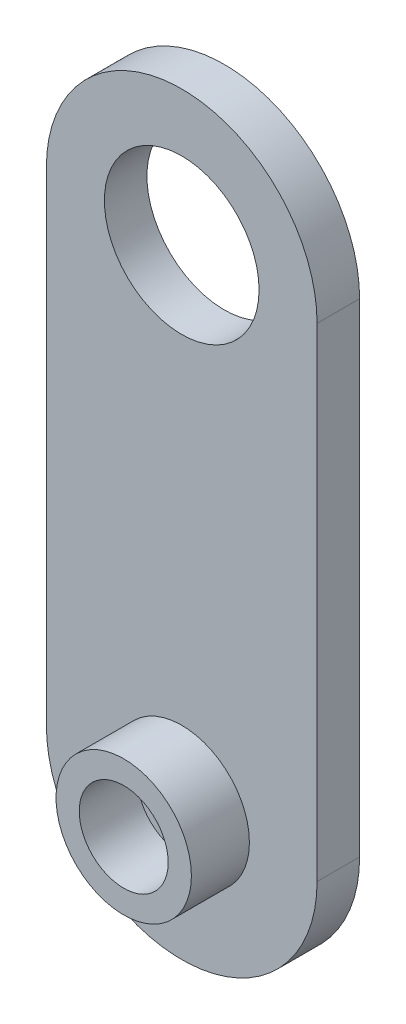
ISO-10303-21;
HEADER;
FILE_DESCRIPTION(('STEP AP214'),'2;1');
FILE_NAME('part.step','',(''),(''),'','','');
FILE_SCHEMA(('AUTOMOTIVE_DESIGN { 1 0 10303 214 1 1 1 1 }'));
ENDSEC;
DATA;
#1=APPLICATION_CONTEXT('core data for automotive mechanical design processes');
#2=APPLICATION_PROTOCOL_DEFINITION('international standard','automotive_design',2000,#1);
#3=PRODUCT_CONTEXT('',#1,'mechanical');
#4=PRODUCT('Part','Part','',(#3));
#5=PRODUCT_RELATED_PRODUCT_CATEGORY('part','',(#4));
#6=PRODUCT_DEFINITION_FORMATION('','',#4);
#7=PRODUCT_DEFINITION_CONTEXT('part definition',#1,'design');
#8=PRODUCT_DEFINITION('design','',#6,#7);
#9=PRODUCT_DEFINITION_SHAPE('','',#8);
#10=(LENGTH_UNIT() NAMED_UNIT(*) SI_UNIT(.MILLI.,.METRE.));
#11=(NAMED_UNIT(*) PLANE_ANGLE_UNIT() SI_UNIT($,.RADIAN.));
#12=(NAMED_UNIT(*) SI_UNIT($,.STERADIAN.) SOLID_ANGLE_UNIT());
#13=UNCERTAINTY_MEASURE_WITH_UNIT(LENGTH_MEASURE(1.E-05),#10,'distance_accuracy_value','');
#14=(GEOMETRIC_REPRESENTATION_CONTEXT(3) GLOBAL_UNCERTAINTY_ASSIGNED_CONTEXT((#13)) GLOBAL_UNIT_ASSIGNED_CONTEXT((#10,
#11,#12)) REPRESENTATION_CONTEXT('',''));
#15=CARTESIAN_POINT('',(0.,0.,0.));
#16=DIRECTION('',(0.,0.,1.));
#17=DIRECTION('',(1.,0.,0.));
#18=AXIS2_PLACEMENT_3D('',#15,#16,#17);
#19=CARTESIAN_POINT('',(0.,0.,2.2));
#20=DIRECTION('',(0.,0.,-1.));
#21=DIRECTION('',(-1.,0.,0.));
#22=AXIS2_PLACEMENT_3D('',#19,#20,#21);
#23=CYLINDRICAL_SURFACE('',#22,1.1);
#24=CARTESIAN_POINT('',(0.,0.,2.2));
#25=DIRECTION('',(0.,0.,1.));
#26=DIRECTION('',(1.,0.,0.));
#27=AXIS2_PLACEMENT_3D('',#24,#25,#26);
#28=CIRCLE('',#27,1.1);
#29=CARTESIAN_POINT('',(1.1,0.,2.2));
#30=VERTEX_POINT('',#29);
#31=EDGE_CURVE('E139',#30,#30,#28,.T.);
#32=ORIENTED_EDGE('',*,*,#31,.T.);
#33=EDGE_LOOP('',(#32));
#34=FACE_BOUND('',#33,.T.);
#35=CARTESIAN_POINT('',(0.,0.,1.));
#36=DIRECTION('',(0.,0.,-1.));
#37=DIRECTION('',(-1.,0.,0.));
#38=AXIS2_PLACEMENT_3D('',#35,#36,#37);
#39=CIRCLE('',#38,1.1);
#40=CARTESIAN_POINT('',(-1.1,0.,1.));
#41=VERTEX_POINT('',#40);
#42=EDGE_CURVE('E45',#41,#41,#39,.T.);
#43=ORIENTED_EDGE('',*,*,#42,.T.);
#44=EDGE_LOOP('',(#43));
#45=FACE_BOUND('',#44,.T.);
#46=ADVANCED_FACE('F41',(#34,#45),#23,.F.);
#47=CARTESIAN_POINT('',(0.,0.,2.2));
#48=DIRECTION('',(0.,0.,1.));
#49=DIRECTION('',(1.,0.,0.));
#50=AXIS2_PLACEMENT_3D('',#47,#48,#49);
#51=PLANE('',#50);
#52=ORIENTED_EDGE('',*,*,#31,.F.);
#53=EDGE_LOOP('',(#52));
#54=FACE_BOUND('',#53,.T.);
#55=CARTESIAN_POINT('',(0.,0.,2.2));
#56=DIRECTION('',(0.,0.,1.));
#57=DIRECTION('',(1.,0.,0.));
#58=AXIS2_PLACEMENT_3D('',#55,#56,#57);
#59=CIRCLE('',#58,2.3);
#60=CARTESIAN_POINT('',(2.3,0.,2.2));
#61=VERTEX_POINT('',#60);
#62=EDGE_CURVE('E11',#61,#61,#59,.F.);
#63=ORIENTED_EDGE('',*,*,#62,.F.);
#64=EDGE_LOOP('',(#63));
#65=FACE_BOUND('',#64,.T.);
#66=ADVANCED_FACE('F182',(#54,#65),#51,.T.);
#67=CARTESIAN_POINT('',(7.,0.,2.2));
#68=DIRECTION('',(1.,0.,0.));
#69=DIRECTION('',(0.,0.,-1.));
#70=AXIS2_PLACEMENT_3D('',#67,#68,#69);
#71=PLANE('',#70);
#72=DIRECTION('',(0.,-1.,0.));
#73=VECTOR('',#72,1.);
#74=CARTESIAN_POINT('',(7.,0.,0.));
#75=LINE('',#74,#73);
#76=CARTESIAN_POINT('',(7.,25.,0.));
#77=VERTEX_POINT('',#76);
#78=CARTESIAN_POINT('',(7.,0.,0.));
#79=VERTEX_POINT('',#78);
#80=EDGE_CURVE('E127',#77,#79,#75,.T.);
#81=ORIENTED_EDGE('',*,*,#80,.F.);
#82=DIRECTION('',(0.,0.,-1.));
#83=VECTOR('',#82,1.);
#84=CARTESIAN_POINT('',(7.,25.,2.2));
#85=LINE('',#84,#83);
#86=CARTESIAN_POINT('',(7.,25.,2.2));
#87=VERTEX_POINT('',#86);
#88=EDGE_CURVE('E52',#87,#77,#85,.T.);
#89=ORIENTED_EDGE('',*,*,#88,.F.);
#90=DIRECTION('',(0.,-1.,0.));
#91=VECTOR('',#90,1.);
#92=CARTESIAN_POINT('',(7.,0.,2.2));
#93=LINE('',#92,#91);
#94=CARTESIAN_POINT('',(7.,0.,2.2));
#95=VERTEX_POINT('',#94);
#96=EDGE_CURVE('E103',#87,#95,#93,.T.);
#97=ORIENTED_EDGE('',*,*,#96,.T.);
#98=DIRECTION('',(0.,0.,-1.));
#99=VECTOR('',#98,1.);
#100=CARTESIAN_POINT('',(7.,0.,2.2));
#101=LINE('',#100,#99);
#102=EDGE_CURVE('E83',#95,#79,#101,.T.);
#103=ORIENTED_EDGE('',*,*,#102,.T.);
#104=EDGE_LOOP('',(#81,#89,#97,#103));
#105=FACE_BOUND('',#104,.T.);
#106=ADVANCED_FACE('F187',(#105),#71,.T.);
#107=CARTESIAN_POINT('',(0.,25.,2.2));
#108=DIRECTION('',(0.,0.,-1.));
#109=DIRECTION('',(-1.,0.,0.));
#110=AXIS2_PLACEMENT_3D('',#107,#108,#109);
#111=CYLINDRICAL_SURFACE('',#110,7.);
#112=CARTESIAN_POINT('',(0.,25.,0.));
#113=DIRECTION('',(0.,0.,1.));
#114=DIRECTION('',(1.,0.,0.));
#115=AXIS2_PLACEMENT_3D('',#112,#113,#114);
#116=CIRCLE('',#115,7.);
#117=CARTESIAN_POINT('',(-7.,25.,0.));
#118=VERTEX_POINT('',#117);
#119=EDGE_CURVE('E109',#77,#118,#116,.T.);
#120=ORIENTED_EDGE('',*,*,#119,.T.);
#121=DIRECTION('',(0.,0.,-1.));
#122=VECTOR('',#121,1.);
#123=CARTESIAN_POINT('',(-7.,25.,2.2));
#124=LINE('',#123,#122);
#125=CARTESIAN_POINT('',(-7.,25.,2.2));
#126=VERTEX_POINT('',#125);
#127=EDGE_CURVE('E96',#126,#118,#124,.T.);
#128=ORIENTED_EDGE('',*,*,#127,.F.);
#129=CARTESIAN_POINT('',(0.,25.,2.2));
#130=DIRECTION('',(0.,0.,1.));
#131=DIRECTION('',(1.,0.,0.));
#132=AXIS2_PLACEMENT_3D('',#129,#130,#131);
#133=CIRCLE('',#132,7.);
#134=EDGE_CURVE('E100',#87,#126,#133,.T.);
#135=ORIENTED_EDGE('',*,*,#134,.F.);
#136=ORIENTED_EDGE('',*,*,#88,.T.);
#137=EDGE_LOOP('',(#120,#128,#135,#136));
#138=FACE_BOUND('',#137,.T.);
#139=ADVANCED_FACE('F107',(#138),#111,.T.);
#140=CARTESIAN_POINT('',(-7.,0.,2.2));
#141=DIRECTION('',(1.,0.,0.));
#142=DIRECTION('',(0.,0.,-1.));
#143=AXIS2_PLACEMENT_3D('',#140,#141,#142);
#144=PLANE('',#143);
#145=DIRECTION('',(0.,-1.,0.));
#146=VECTOR('',#145,1.);
#147=CARTESIAN_POINT('',(-7.,0.,0.));
#148=LINE('',#147,#146);
#149=CARTESIAN_POINT('',(-7.,0.,0.));
#150=VERTEX_POINT('',#149);
#151=EDGE_CURVE('E122',#118,#150,#148,.T.);
#152=ORIENTED_EDGE('',*,*,#151,.T.);
#153=DIRECTION('',(0.,0.,-1.));
#154=VECTOR('',#153,1.);
#155=CARTESIAN_POINT('',(-7.,0.,2.2));
#156=LINE('',#155,#154);
#157=CARTESIAN_POINT('',(-7.,0.,2.2));
#158=VERTEX_POINT('',#157);
#159=EDGE_CURVE('E98',#158,#150,#156,.T.);
#160=ORIENTED_EDGE('',*,*,#159,.F.);
#161=DIRECTION('',(0.,-1.,0.));
#162=VECTOR('',#161,1.);
#163=CARTESIAN_POINT('',(-7.,0.,2.2));
#164=LINE('',#163,#162);
#165=EDGE_CURVE('E91',#126,#158,#164,.T.);
#166=ORIENTED_EDGE('',*,*,#165,.F.);
#167=ORIENTED_EDGE('',*,*,#127,.T.);
#168=EDGE_LOOP('',(#152,#160,#166,#167));
#169=FACE_BOUND('',#168,.T.);
#170=ADVANCED_FACE('F94',(#169),#144,.F.);
#171=CARTESIAN_POINT('',(0.,25.,2.2));
#172=DIRECTION('',(0.,0.,-1.));
#173=DIRECTION('',(-1.,0.,0.));
#174=AXIS2_PLACEMENT_3D('',#171,#172,#173);
#175=CYLINDRICAL_SURFACE('',#174,4.);
#176=CARTESIAN_POINT('',(0.,25.,2.2));
#177=DIRECTION('',(0.,0.,1.));
#178=DIRECTION('',(1.,0.,0.));
#179=AXIS2_PLACEMENT_3D('',#176,#177,#178);
#180=CIRCLE('',#179,4.);
#181=CARTESIAN_POINT('',(4.,25.,2.2));
#182=VERTEX_POINT('',#181);
#183=EDGE_CURVE('E121',#182,#182,#180,.F.);
#184=ORIENTED_EDGE('',*,*,#183,.F.);
#185=EDGE_LOOP('',(#184));
#186=FACE_BOUND('',#185,.T.);
#187=CARTESIAN_POINT('',(0.,25.,0.));
#188=DIRECTION('',(0.,0.,1.));
#189=DIRECTION('',(1.,0.,0.));
#190=AXIS2_PLACEMENT_3D('',#187,#188,#189);
#191=CIRCLE('',#190,4.);
#192=CARTESIAN_POINT('',(4.,25.,0.));
#193=VERTEX_POINT('',#192);
#194=EDGE_CURVE('E130',#193,#193,#191,.F.);
#195=ORIENTED_EDGE('',*,*,#194,.T.);
#196=EDGE_LOOP('',(#195));
#197=FACE_BOUND('',#196,.T.);
#198=ADVANCED_FACE('F43',(#186,#197),#175,.F.);
#199=CARTESIAN_POINT('',(0.,0.,2.2));
#200=DIRECTION('',(0.,0.,-1.));
#201=DIRECTION('',(-1.,0.,0.));
#202=AXIS2_PLACEMENT_3D('',#199,#200,#201);
#203=CYLINDRICAL_SURFACE('',#202,7.);
#204=CARTESIAN_POINT('',(0.,0.,0.));
#205=DIRECTION('',(0.,0.,1.));
#206=DIRECTION('',(1.,0.,0.));
#207=AXIS2_PLACEMENT_3D('',#204,#205,#206);
#208=CIRCLE('',#207,7.);
#209=EDGE_CURVE('E76',#150,#79,#208,.T.);
#210=ORIENTED_EDGE('',*,*,#209,.T.);
#211=ORIENTED_EDGE('',*,*,#102,.F.);
#212=CARTESIAN_POINT('',(0.,0.,2.2));
#213=DIRECTION('',(0.,0.,1.));
#214=DIRECTION('',(1.,0.,0.));
#215=AXIS2_PLACEMENT_3D('',#212,#213,#214);
#216=CIRCLE('',#215,7.);
#217=EDGE_CURVE('E60',#158,#95,#216,.T.);
#218=ORIENTED_EDGE('',*,*,#217,.F.);
#219=ORIENTED_EDGE('',*,*,#159,.T.);
#220=EDGE_LOOP('',(#210,#211,#218,#219));
#221=FACE_BOUND('',#220,.T.);
#222=ADVANCED_FACE('F197',(#221),#203,.T.);
#223=CARTESIAN_POINT('',(0.,0.,2.2));
#224=DIRECTION('',(0.,0.,1.));
#225=DIRECTION('',(1.,0.,0.));
#226=AXIS2_PLACEMENT_3D('',#223,#224,#225);
#227=CIRCLE('',#226,3.5);
#228=CARTESIAN_POINT('',(3.5,0.,2.2));
#229=VERTEX_POINT('',#228);
#230=EDGE_CURVE('E146',#229,#229,#227,.T.);
#231=ORIENTED_EDGE('',*,*,#230,.F.);
#232=EDGE_LOOP('',(#231));
#233=FACE_BOUND('',#232,.T.);
#234=ORIENTED_EDGE('',*,*,#183,.T.);
#235=EDGE_LOOP('',(#234));
#236=FACE_BOUND('',#235,.T.);
#237=ORIENTED_EDGE('',*,*,#96,.F.);
#238=ORIENTED_EDGE('',*,*,#134,.T.);
#239=ORIENTED_EDGE('',*,*,#165,.T.);
#240=ORIENTED_EDGE('',*,*,#217,.T.);
#241=EDGE_LOOP('',(#237,#238,#239,#240));
#242=FACE_BOUND('',#241,.T.);
#243=ADVANCED_FACE('F102',(#233,#236,#242),#51,.T.);
#244=CARTESIAN_POINT('',(0.,0.,0.));
#245=DIRECTION('',(0.,0.,1.));
#246=DIRECTION('',(1.,0.,0.));
#247=AXIS2_PLACEMENT_3D('',#244,#245,#246);
#248=PLANE('',#247);
#249=CARTESIAN_POINT('',(0.,0.,0.));
#250=DIRECTION('',(0.,0.,-1.));
#251=DIRECTION('',(-1.,0.,0.));
#252=AXIS2_PLACEMENT_3D('',#249,#250,#251);
#253=CIRCLE('',#252,2.25);
#254=CARTESIAN_POINT('',(-2.25,0.,0.));
#255=VERTEX_POINT('',#254);
#256=EDGE_CURVE('E157',#255,#255,#253,.T.);
#257=ORIENTED_EDGE('',*,*,#256,.F.);
#258=EDGE_LOOP('',(#257));
#259=FACE_BOUND('',#258,.T.);
#260=ORIENTED_EDGE('',*,*,#194,.F.);
#261=EDGE_LOOP('',(#260));
#262=FACE_BOUND('',#261,.T.);
#263=ORIENTED_EDGE('',*,*,#80,.T.);
#264=ORIENTED_EDGE('',*,*,#209,.F.);
#265=ORIENTED_EDGE('',*,*,#151,.F.);
#266=ORIENTED_EDGE('',*,*,#119,.F.);
#267=EDGE_LOOP('',(#263,#264,#265,#266));
#268=FACE_BOUND('',#267,.T.);
#269=ADVANCED_FACE('F201',(#259,#262,#268),#248,.F.);
#270=CARTESIAN_POINT('',(0.,0.,5.2));
#271=DIRECTION('',(0.,0.,1.));
#272=DIRECTION('',(1.,0.,0.));
#273=AXIS2_PLACEMENT_3D('',#270,#271,#272);
#274=PLANE('',#273);
#275=CARTESIAN_POINT('',(0.,0.,5.2));
#276=DIRECTION('',(0.,0.,1.));
#277=DIRECTION('',(1.,0.,0.));
#278=AXIS2_PLACEMENT_3D('',#275,#276,#277);
#279=CIRCLE('',#278,3.5);
#280=CARTESIAN_POINT('',(3.5,0.,5.2));
#281=VERTEX_POINT('',#280);
#282=EDGE_CURVE('E134',#281,#281,#279,.T.);
#283=ORIENTED_EDGE('',*,*,#282,.T.);
#284=EDGE_LOOP('',(#283));
#285=FACE_BOUND('',#284,.T.);
#286=CARTESIAN_POINT('',(0.,0.,5.2));
#287=DIRECTION('',(0.,0.,1.));
#288=DIRECTION('',(1.,0.,0.));
#289=AXIS2_PLACEMENT_3D('',#286,#287,#288);
#290=CIRCLE('',#289,2.3);
#291=CARTESIAN_POINT('',(2.3,0.,5.2));
#292=VERTEX_POINT('',#291);
#293=EDGE_CURVE('E150',#292,#292,#290,.T.);
#294=ORIENTED_EDGE('',*,*,#293,.F.);
#295=EDGE_LOOP('',(#294));
#296=FACE_BOUND('',#295,.T.);
#297=ADVANCED_FACE('F203',(#285,#296),#274,.T.);
#298=CARTESIAN_POINT('',(0.,0.,5.2));
#299=DIRECTION('',(0.,0.,-1.));
#300=DIRECTION('',(-1.,0.,0.));
#301=AXIS2_PLACEMENT_3D('',#298,#299,#300);
#302=CYLINDRICAL_SURFACE('',#301,3.5);
#303=ORIENTED_EDGE('',*,*,#282,.F.);
#304=EDGE_LOOP('',(#303));
#305=FACE_BOUND('',#304,.T.);
#306=ORIENTED_EDGE('',*,*,#230,.T.);
#307=EDGE_LOOP('',(#306));
#308=FACE_BOUND('',#307,.T.);
#309=ADVANCED_FACE('F208',(#305,#308),#302,.T.);
#310=CARTESIAN_POINT('',(0.,0.,5.2));
#311=DIRECTION('',(0.,0.,-1.));
#312=DIRECTION('',(-1.,0.,0.));
#313=AXIS2_PLACEMENT_3D('',#310,#311,#312);
#314=CYLINDRICAL_SURFACE('',#313,2.3);
#315=ORIENTED_EDGE('',*,*,#293,.T.);
#316=EDGE_LOOP('',(#315));
#317=FACE_BOUND('',#316,.T.);
#318=ORIENTED_EDGE('',*,*,#62,.T.);
#319=EDGE_LOOP('',(#318));
#320=FACE_BOUND('',#319,.T.);
#321=ADVANCED_FACE('F178',(#317,#320),#314,.F.);
#322=CARTESIAN_POINT('',(0.,0.,1.));
#323=DIRECTION('',(0.,0.,-1.));
#324=DIRECTION('',(-1.,0.,0.));
#325=AXIS2_PLACEMENT_3D('',#322,#323,#324);
#326=CYLINDRICAL_SURFACE('',#325,2.25);
#327=CARTESIAN_POINT('',(0.,0.,1.));
#328=DIRECTION('',(0.,0.,-1.));
#329=DIRECTION('',(-1.,0.,0.));
#330=AXIS2_PLACEMENT_3D('',#327,#328,#329);
#331=CIRCLE('',#330,2.25);
#332=CARTESIAN_POINT('',(-2.25,0.,1.));
#333=VERTEX_POINT('',#332);
#334=EDGE_CURVE('E161',#333,#333,#331,.T.);
#335=ORIENTED_EDGE('',*,*,#334,.F.);
#336=EDGE_LOOP('',(#335));
#337=FACE_BOUND('',#336,.T.);
#338=ORIENTED_EDGE('',*,*,#256,.T.);
#339=EDGE_LOOP('',(#338));
#340=FACE_BOUND('',#339,.T.);
#341=ADVANCED_FACE('F173',(#337,#340),#326,.F.);
#342=CARTESIAN_POINT('',(0.,0.,1.));
#343=DIRECTION('',(0.,0.,-1.));
#344=DIRECTION('',(-1.,0.,0.));
#345=AXIS2_PLACEMENT_3D('',#342,#343,#344);
#346=PLANE('',#345);
#347=ORIENTED_EDGE('',*,*,#42,.F.);
#348=EDGE_LOOP('',(#347));
#349=FACE_BOUND('',#348,.T.);
#350=ORIENTED_EDGE('',*,*,#334,.T.);
#351=EDGE_LOOP('',(#350));
#352=FACE_BOUND('',#351,.T.);
#353=ADVANCED_FACE('F171',(#349,#352),#346,.T.);
#354=CLOSED_SHELL('',(#46,#66,#106,#139,#170,#198,#222,#243,#269,#297,#309,#321,#341,#353));
#355=MANIFOLD_SOLID_BREP('B2',#354);
#356=ADVANCED_BREP_SHAPE_REPRESENTATION('',(#18,#355),#14);
#357=SHAPE_DEFINITION_REPRESENTATION(#9,#356);
ENDSEC;
END-ISO-10303-21;
